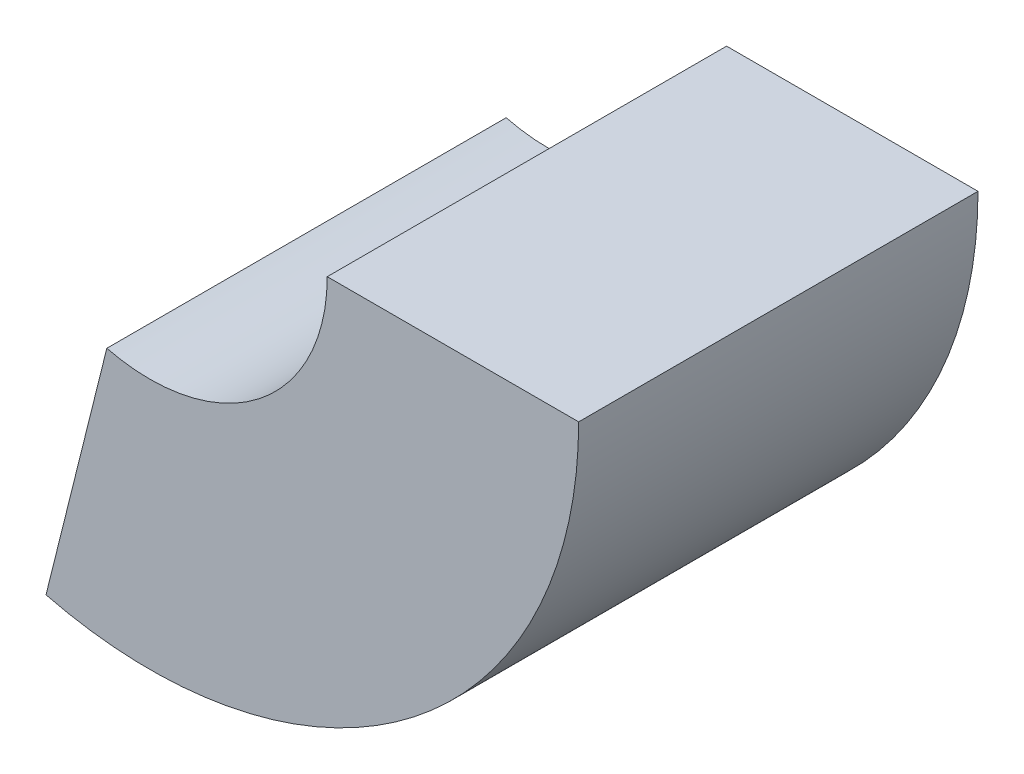
ISO-10303-21;
HEADER;
FILE_DESCRIPTION(('STEP AP214'),'2;1');
FILE_NAME('part.step','',(''),(''),'','','');
FILE_SCHEMA(('AUTOMOTIVE_DESIGN { 1 0 10303 214 1 1 1 1 }'));
ENDSEC;
DATA;
#1=APPLICATION_CONTEXT('core data for automotive mechanical design processes');
#2=APPLICATION_PROTOCOL_DEFINITION('international standard','automotive_design',2000,#1);
#3=PRODUCT_CONTEXT('',#1,'mechanical');
#4=PRODUCT('Part','Part','',(#3));
#5=PRODUCT_RELATED_PRODUCT_CATEGORY('part','',(#4));
#6=PRODUCT_DEFINITION_FORMATION('','',#4);
#7=PRODUCT_DEFINITION_CONTEXT('part definition',#1,'design');
#8=PRODUCT_DEFINITION('design','',#6,#7);
#9=PRODUCT_DEFINITION_SHAPE('','',#8);
#10=(LENGTH_UNIT() NAMED_UNIT(*) SI_UNIT(.MILLI.,.METRE.));
#11=(NAMED_UNIT(*) PLANE_ANGLE_UNIT() SI_UNIT($,.RADIAN.));
#12=(NAMED_UNIT(*) SI_UNIT($,.STERADIAN.) SOLID_ANGLE_UNIT());
#13=UNCERTAINTY_MEASURE_WITH_UNIT(LENGTH_MEASURE(1.E-05),#10,'distance_accuracy_value','');
#14=(GEOMETRIC_REPRESENTATION_CONTEXT(3) GLOBAL_UNCERTAINTY_ASSIGNED_CONTEXT((#13)) GLOBAL_UNIT_ASSIGNED_CONTEXT((#10,
#11,#12)) REPRESENTATION_CONTEXT('',''));
#15=CARTESIAN_POINT('',(0.,0.,0.));
#16=DIRECTION('',(0.,0.,1.));
#17=DIRECTION('',(1.,0.,0.));
#18=AXIS2_PLACEMENT_3D('',#15,#16,#17);
#19=CARTESIAN_POINT('',(4.,0.,16.));
#20=DIRECTION('',(0.,0.,1.));
#21=DIRECTION('',(1.,0.,0.));
#22=AXIS2_PLACEMENT_3D('',#19,#20,#21);
#23=CYLINDRICAL_SURFACE('',#22,12.);
#24=CARTESIAN_POINT('',(4.,0.,-16.));
#25=DIRECTION('',(0.,0.,1.));
#26=DIRECTION('',(1.,0.,0.));
#27=AXIS2_PLACEMENT_3D('',#24,#25,#26);
#28=CIRCLE('',#27,12.);
#29=CARTESIAN_POINT('',(1.09693725280399,-11.643548715312,-16.));
#30=VERTEX_POINT('',#29);
#31=CARTESIAN_POINT('',(16.,0.,-16.));
#32=VERTEX_POINT('',#31);
#33=EDGE_CURVE('E11',#30,#32,#28,.T.);
#34=ORIENTED_EDGE('',*,*,#33,.F.);
#35=DIRECTION('',(0.,0.,1.));
#36=VECTOR('',#35,1.);
#37=CARTESIAN_POINT('',(1.09693725280399,-11.643548715312,11.));
#38=LINE('',#37,#36);
#39=CARTESIAN_POINT('',(1.09693725280399,-11.643548715312,11.));
#40=VERTEX_POINT('',#39);
#41=EDGE_CURVE('E85',#30,#40,#38,.T.);
#42=ORIENTED_EDGE('',*,*,#41,.T.);
#43=CARTESIAN_POINT('',(4.,0.,11.));
#44=DIRECTION('',(0.,0.,1.));
#45=DIRECTION('',(1.,0.,0.));
#46=AXIS2_PLACEMENT_3D('',#43,#44,#45);
#47=CIRCLE('',#46,12.);
#48=CARTESIAN_POINT('',(16.,0.,11.));
#49=VERTEX_POINT('',#48);
#50=EDGE_CURVE('E77',#40,#49,#47,.T.);
#51=ORIENTED_EDGE('',*,*,#50,.T.);
#52=DIRECTION('',(0.,0.,1.));
#53=VECTOR('',#52,1.);
#54=CARTESIAN_POINT('',(16.,0.,11.));
#55=LINE('',#54,#53);
#56=EDGE_CURVE('E79',#32,#49,#55,.T.);
#57=ORIENTED_EDGE('',*,*,#56,.F.);
#58=EDGE_LOOP('',(#34,#42,#51,#57));
#59=FACE_BOUND('',#58,.T.);
#60=ADVANCED_FACE('F41',(#59),#23,.F.);
#61=CARTESIAN_POINT('',(1.09693725280399,-11.643548715312,-16.));
#62=DIRECTION('',(0.,0.,-1.));
#63=DIRECTION('',(-1.,0.,0.));
#64=AXIS2_PLACEMENT_3D('',#61,#62,#63);
#65=PLANE('',#64);
#66=CARTESIAN_POINT('',(4.,0.,-16.));
#67=DIRECTION('',(0.,0.,1.));
#68=DIRECTION('',(1.,0.,0.));
#69=AXIS2_PLACEMENT_3D('',#66,#67,#68);
#70=CIRCLE('',#69,29.);
#71=CARTESIAN_POINT('',(-3.01573497239037,-28.1385760620039,-16.));
#72=VERTEX_POINT('',#71);
#73=CARTESIAN_POINT('',(33.,0.,-16.));
#74=VERTEX_POINT('',#73);
#75=EDGE_CURVE('E47',#72,#74,#70,.T.);
#76=ORIENTED_EDGE('',*,*,#75,.F.);
#77=DIRECTION('',(0.241921895599668,0.970295726275996,0.));
#78=VECTOR('',#77,1.);
#79=CARTESIAN_POINT('',(1.09693725280399,-11.643548715312,-16.));
#80=LINE('',#79,#78);
#81=EDGE_CURVE('E90',#72,#30,#80,.T.);
#82=ORIENTED_EDGE('',*,*,#81,.T.);
#83=ORIENTED_EDGE('',*,*,#33,.T.);
#84=DIRECTION('',(-1.,0.,0.));
#85=VECTOR('',#84,1.);
#86=CARTESIAN_POINT('',(16.,0.,-16.));
#87=LINE('',#86,#85);
#88=EDGE_CURVE('E98',#74,#32,#87,.T.);
#89=ORIENTED_EDGE('',*,*,#88,.F.);
#90=EDGE_LOOP('',(#76,#82,#83,#89));
#91=FACE_BOUND('',#90,.T.);
#92=ADVANCED_FACE('F43',(#91),#65,.T.);
#93=CARTESIAN_POINT('',(4.,0.,16.));
#94=DIRECTION('',(0.,0.,1.));
#95=DIRECTION('',(1.,0.,0.));
#96=AXIS2_PLACEMENT_3D('',#93,#94,#95);
#97=CYLINDRICAL_SURFACE('',#96,29.);
#98=CARTESIAN_POINT('',(4.,0.,11.));
#99=DIRECTION('',(0.,0.,1.));
#100=DIRECTION('',(1.,0.,0.));
#101=AXIS2_PLACEMENT_3D('',#98,#99,#100);
#102=CIRCLE('',#101,29.);
#103=CARTESIAN_POINT('',(-3.01573497239037,-28.1385760620039,11.));
#104=VERTEX_POINT('',#103);
#105=CARTESIAN_POINT('',(33.,0.,11.));
#106=VERTEX_POINT('',#105);
#107=EDGE_CURVE('E86',#104,#106,#102,.T.);
#108=ORIENTED_EDGE('',*,*,#107,.F.);
#109=DIRECTION('',(0.,0.,-1.));
#110=VECTOR('',#109,1.);
#111=CARTESIAN_POINT('',(-3.01573497239037,-28.1385760620039,11.));
#112=LINE('',#111,#110);
#113=EDGE_CURVE('E109',#104,#72,#112,.T.);
#114=ORIENTED_EDGE('',*,*,#113,.T.);
#115=ORIENTED_EDGE('',*,*,#75,.T.);
#116=DIRECTION('',(0.,0.,-1.));
#117=VECTOR('',#116,1.);
#118=CARTESIAN_POINT('',(33.,0.,11.));
#119=LINE('',#118,#117);
#120=EDGE_CURVE('E94',#106,#74,#119,.T.);
#121=ORIENTED_EDGE('',*,*,#120,.F.);
#122=EDGE_LOOP('',(#108,#114,#115,#121));
#123=FACE_BOUND('',#122,.T.);
#124=ADVANCED_FACE('F112',(#123),#97,.T.);
#125=CARTESIAN_POINT('',(1.09693725280399,-11.643548715312,11.));
#126=DIRECTION('',(0.,0.,1.));
#127=DIRECTION('',(1.,0.,0.));
#128=AXIS2_PLACEMENT_3D('',#125,#126,#127);
#129=PLANE('',#128);
#130=DIRECTION('',(-0.241921895599668,-0.970295726275996,0.));
#131=VECTOR('',#130,1.);
#132=CARTESIAN_POINT('',(1.09693725280399,-11.643548715312,11.));
#133=LINE('',#132,#131);
#134=EDGE_CURVE('E103',#40,#104,#133,.T.);
#135=ORIENTED_EDGE('',*,*,#134,.T.);
#136=ORIENTED_EDGE('',*,*,#107,.T.);
#137=DIRECTION('',(1.,0.,0.));
#138=VECTOR('',#137,1.);
#139=CARTESIAN_POINT('',(16.,0.,11.));
#140=LINE('',#139,#138);
#141=EDGE_CURVE('E89',#49,#106,#140,.T.);
#142=ORIENTED_EDGE('',*,*,#141,.F.);
#143=ORIENTED_EDGE('',*,*,#50,.F.);
#144=EDGE_LOOP('',(#135,#136,#142,#143));
#145=FACE_BOUND('',#144,.T.);
#146=ADVANCED_FACE('F91',(#145),#129,.T.);
#147=CARTESIAN_POINT('',(4.96768758239867,3.88118290510399,0.));
#148=DIRECTION('',(-0.970295726275996,0.241921895599668,0.));
#149=DIRECTION('',(0.,0.,-1.));
#150=AXIS2_PLACEMENT_3D('',#147,#148,#149);
#151=PLANE('',#150);
#152=ORIENTED_EDGE('',*,*,#41,.F.);
#153=ORIENTED_EDGE('',*,*,#81,.F.);
#154=ORIENTED_EDGE('',*,*,#113,.F.);
#155=ORIENTED_EDGE('',*,*,#134,.F.);
#156=EDGE_LOOP('',(#152,#153,#154,#155));
#157=FACE_BOUND('',#156,.T.);
#158=ADVANCED_FACE('F113',(#157),#151,.T.);
#159=CARTESIAN_POINT('',(0.,0.,0.));
#160=DIRECTION('',(0.,-1.,0.));
#161=DIRECTION('',(0.,0.,-1.));
#162=AXIS2_PLACEMENT_3D('',#159,#160,#161);
#163=PLANE('',#162);
#164=ORIENTED_EDGE('',*,*,#56,.T.);
#165=ORIENTED_EDGE('',*,*,#141,.T.);
#166=ORIENTED_EDGE('',*,*,#120,.T.);
#167=ORIENTED_EDGE('',*,*,#88,.T.);
#168=EDGE_LOOP('',(#164,#165,#166,#167));
#169=FACE_BOUND('',#168,.T.);
#170=ADVANCED_FACE('F97',(#169),#163,.F.);
#171=CLOSED_SHELL('',(#60,#92,#124,#146,#158,#170));
#172=MANIFOLD_SOLID_BREP('B2',#171);
#173=ADVANCED_BREP_SHAPE_REPRESENTATION('',(#18,#172),#14);
#174=SHAPE_DEFINITION_REPRESENTATION(#9,#173);
ENDSEC;
END-ISO-10303-21;
